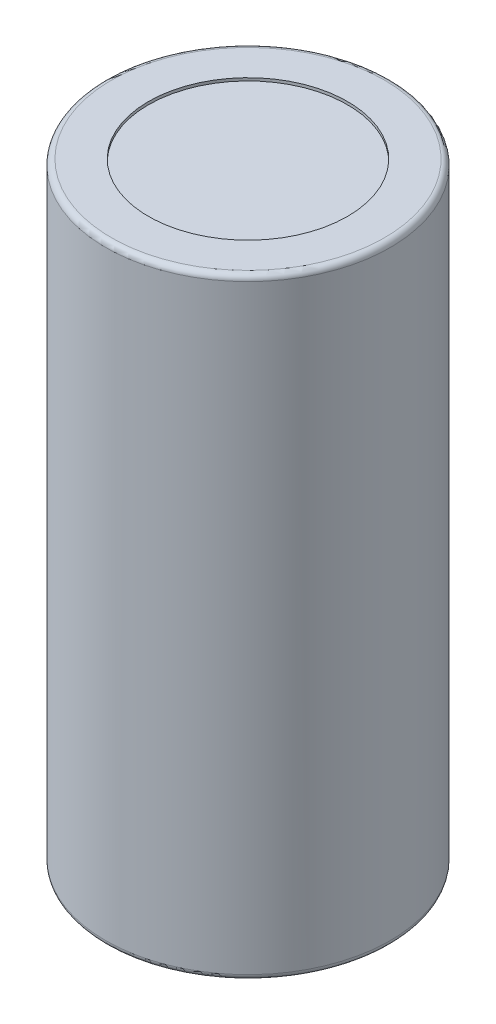
ISO-10303-21;
HEADER;
FILE_DESCRIPTION(('STEP AP214'),'2;1');
FILE_NAME('part.step','',(''),(''),'','','');
FILE_SCHEMA(('AUTOMOTIVE_DESIGN { 1 0 10303 214 1 1 1 1 }'));
ENDSEC;
DATA;
#1=APPLICATION_CONTEXT('core data for automotive mechanical design processes');
#2=APPLICATION_PROTOCOL_DEFINITION('international standard','automotive_design',2000,#1);
#3=PRODUCT_CONTEXT('',#1,'mechanical');
#4=PRODUCT('Part','Part','',(#3));
#5=PRODUCT_RELATED_PRODUCT_CATEGORY('part','',(#4));
#6=PRODUCT_DEFINITION_FORMATION('','',#4);
#7=PRODUCT_DEFINITION_CONTEXT('part definition',#1,'design');
#8=PRODUCT_DEFINITION('design','',#6,#7);
#9=PRODUCT_DEFINITION_SHAPE('','',#8);
#10=(LENGTH_UNIT() NAMED_UNIT(*) SI_UNIT(.MILLI.,.METRE.));
#11=(NAMED_UNIT(*) PLANE_ANGLE_UNIT() SI_UNIT($,.RADIAN.));
#12=(NAMED_UNIT(*) SI_UNIT($,.STERADIAN.) SOLID_ANGLE_UNIT());
#13=UNCERTAINTY_MEASURE_WITH_UNIT(LENGTH_MEASURE(1.E-05),#10,'distance_accuracy_value','');
#14=(GEOMETRIC_REPRESENTATION_CONTEXT(3) GLOBAL_UNCERTAINTY_ASSIGNED_CONTEXT((#13)) GLOBAL_UNIT_ASSIGNED_CONTEXT((#10,
#11,#12)) REPRESENTATION_CONTEXT('',''));
#15=CARTESIAN_POINT('',(0.,0.,0.));
#16=DIRECTION('',(0.,0.,1.));
#17=DIRECTION('',(1.,0.,0.));
#18=AXIS2_PLACEMENT_3D('',#15,#16,#17);
#19=CARTESIAN_POINT('',(75.0000011175871,21.4,6.00000008940696));
#20=DIRECTION('',(0.,-1.,0.));
#21=DIRECTION('',(-1.,0.,0.));
#22=AXIS2_PLACEMENT_3D('',#19,#20,#21);
#23=PLANE('',#22);
#24=CARTESIAN_POINT('',(75.0000011175871,21.4,6.00000008940696));
#25=DIRECTION('',(0.,-1.,0.));
#26=DIRECTION('',(1.,0.,0.));
#27=AXIS2_PLACEMENT_3D('',#24,#25,#26);
#28=CIRCLE('',#27,3.5);
#29=CARTESIAN_POINT('',(71.5000011175871,21.4,6.00000008940696));
#30=VERTEX_POINT('',#29);
#31=EDGE_CURVE('E11',#30,#30,#28,.T.);
#32=ORIENTED_EDGE('',*,*,#31,.F.);
#33=EDGE_LOOP('',(#32));
#34=FACE_BOUND('',#33,.T.);
#35=ADVANCED_FACE('F16',(#34),#23,.F.);
#36=CARTESIAN_POINT('',(75.0000011175871,21.45,6.00000008940696));
#37=DIRECTION('',(0.,-1.,0.));
#38=DIRECTION('',(1.,0.,0.));
#39=AXIS2_PLACEMENT_3D('',#36,#37,#38);
#40=CYLINDRICAL_SURFACE('',#39,3.5);
#41=CARTESIAN_POINT('',(75.0000011175871,21.5,6.00000008940696));
#42=DIRECTION('',(0.,-1.,0.));
#43=DIRECTION('',(1.,0.,0.));
#44=AXIS2_PLACEMENT_3D('',#41,#42,#43);
#45=CIRCLE('',#44,3.5);
#46=CARTESIAN_POINT('',(71.5000011175871,21.5,6.00000008940696));
#47=VERTEX_POINT('',#46);
#48=EDGE_CURVE('E87',#47,#47,#45,.T.);
#49=ORIENTED_EDGE('',*,*,#48,.F.);
#50=DIRECTION('',(0.,-1.,0.));
#51=VECTOR('',#50,1.);
#52=CARTESIAN_POINT('',(71.5000011175871,21.45,6.00000008940696));
#53=LINE('',#52,#51);
#54=EDGE_CURVE('E25',#47,#30,#53,.T.);
#55=ORIENTED_EDGE('',*,*,#54,.T.);
#56=ORIENTED_EDGE('',*,*,#31,.T.);
#57=ORIENTED_EDGE('',*,*,#54,.F.);
#58=EDGE_LOOP('',(#49,#55,#56,#57));
#59=FACE_BOUND('',#58,.T.);
#60=ADVANCED_FACE('F135',(#59),#40,.F.);
#61=CARTESIAN_POINT('',(75.0000011175871,21.5,6.00000008940696));
#62=DIRECTION('',(0.,1.,0.));
#63=DIRECTION('',(0.,0.,-1.));
#64=AXIS2_PLACEMENT_3D('',#61,#62,#63);
#65=PLANE('',#64);
#66=ORIENTED_EDGE('',*,*,#48,.T.);
#67=EDGE_LOOP('',(#66));
#68=FACE_BOUND('',#67,.T.);
#69=CARTESIAN_POINT('',(75.0000011175871,21.5,6.00000008940696));
#70=DIRECTION('',(0.,-1.,0.));
#71=DIRECTION('',(-1.,0.,0.));
#72=AXIS2_PLACEMENT_3D('',#69,#70,#71);
#73=CIRCLE('',#72,4.80000007450581);
#74=CARTESIAN_POINT('',(75.0000011175871,21.5,1.20000001490116));
#75=VERTEX_POINT('',#74);
#76=EDGE_CURVE('E19',#75,#75,#73,.T.);
#77=ORIENTED_EDGE('',*,*,#76,.F.);
#78=EDGE_LOOP('',(#77));
#79=FACE_BOUND('',#78,.T.);
#80=ADVANCED_FACE('F131',(#68,#79),#65,.T.);
#81=CARTESIAN_POINT('',(75.0000011175871,21.3,6.00000008940696));
#82=DIRECTION('',(0.,1.,0.));
#83=DIRECTION('',(0.,0.,1.));
#84=AXIS2_PLACEMENT_3D('',#81,#82,#83);
#85=TOROIDAL_SURFACE('',#84,4.80000007450581,0.2);
#86=ORIENTED_EDGE('',*,*,#76,.T.);
#87=CARTESIAN_POINT('',(75.0000011175871,21.3,1.20000001490116));
#88=DIRECTION('',(-1.,0.,0.));
#89=DIRECTION('',(0.,0.,-1.));
#90=AXIS2_PLACEMENT_3D('',#87,#88,#89);
#91=CIRCLE('',#90,0.2);
#92=CARTESIAN_POINT('',(75.0000011175871,21.3,1.00000001490116));
#93=VERTEX_POINT('',#92);
#94=EDGE_CURVE('E83',#75,#93,#91,.T.);
#95=ORIENTED_EDGE('',*,*,#94,.T.);
#96=CARTESIAN_POINT('',(75.0000011175871,21.3,6.00000008940696));
#97=DIRECTION('',(0.,1.,0.));
#98=DIRECTION('',(-1.,0.,0.));
#99=AXIS2_PLACEMENT_3D('',#96,#97,#98);
#100=CIRCLE('',#99,5.00000007450581);
#101=CARTESIAN_POINT('',(70.0000010430813,21.3,6.00000008940696));
#102=VERTEX_POINT('',#101);
#103=EDGE_CURVE('E79',#93,#102,#100,.T.);
#104=ORIENTED_EDGE('',*,*,#103,.T.);
#105=CARTESIAN_POINT('',(75.0000011175871,21.3,6.00000008940696));
#106=DIRECTION('',(0.,1.,0.));
#107=DIRECTION('',(-1.,0.,0.));
#108=AXIS2_PLACEMENT_3D('',#105,#106,#107);
#109=CIRCLE('',#108,5.00000007450581);
#110=EDGE_CURVE('E92',#102,#93,#109,.T.);
#111=ORIENTED_EDGE('',*,*,#110,.T.);
#112=ORIENTED_EDGE('',*,*,#94,.F.);
#113=EDGE_LOOP('',(#86,#95,#104,#111,#112));
#114=FACE_BOUND('',#113,.T.);
#115=ADVANCED_FACE('F84',(#114),#85,.T.);
#116=CARTESIAN_POINT('',(75.0000011175871,0.,6.00000008940697));
#117=DIRECTION('',(0.,-1.,0.));
#118=DIRECTION('',(-1.,0.,0.));
#119=AXIS2_PLACEMENT_3D('',#116,#117,#118);
#120=PLANE('',#119);
#121=CARTESIAN_POINT('',(75.0000011175871,0.,6.00000008940697));
#122=DIRECTION('',(0.,1.,0.));
#123=DIRECTION('',(-1.,0.,0.));
#124=AXIS2_PLACEMENT_3D('',#121,#122,#123);
#125=CIRCLE('',#124,4.80000007450581);
#126=CARTESIAN_POINT('',(75.0000011175871,0.,10.8000001639128));
#127=VERTEX_POINT('',#126);
#128=EDGE_CURVE('E112',#127,#127,#125,.T.);
#129=ORIENTED_EDGE('',*,*,#128,.F.);
#130=EDGE_LOOP('',(#129));
#131=FACE_BOUND('',#130,.T.);
#132=ADVANCED_FACE('F122',(#131),#120,.T.);
#133=CARTESIAN_POINT('',(75.0000011175871,10.75,6.00000008940697));
#134=DIRECTION('',(0.,1.,0.));
#135=DIRECTION('',(1.,0.,0.));
#136=AXIS2_PLACEMENT_3D('',#133,#134,#135);
#137=CYLINDRICAL_SURFACE('',#136,5.00000007450581);
#138=ORIENTED_EDGE('',*,*,#110,.F.);
#139=DIRECTION('',(0.,-1.,0.));
#140=VECTOR('',#139,1.);
#141=CARTESIAN_POINT('',(70.0000010430813,10.75,6.00000008940697));
#142=LINE('',#141,#140);
#143=CARTESIAN_POINT('',(70.0000010430813,0.2,6.00000008940697));
#144=VERTEX_POINT('',#143);
#145=EDGE_CURVE('E93',#102,#144,#142,.T.);
#146=ORIENTED_EDGE('',*,*,#145,.T.);
#147=CARTESIAN_POINT('',(75.0000011175871,0.2,6.00000008940697));
#148=DIRECTION('',(0.,-1.,0.));
#149=DIRECTION('',(-1.,0.,0.));
#150=AXIS2_PLACEMENT_3D('',#147,#148,#149);
#151=CIRCLE('',#150,5.00000007450581);
#152=CARTESIAN_POINT('',(75.0000011175871,0.2,11.0000001639128));
#153=VERTEX_POINT('',#152);
#154=EDGE_CURVE('E103',#153,#144,#151,.T.);
#155=ORIENTED_EDGE('',*,*,#154,.F.);
#156=CARTESIAN_POINT('',(75.0000011175871,0.2,6.00000008940697));
#157=DIRECTION('',(0.,-1.,0.));
#158=DIRECTION('',(-1.,0.,0.));
#159=AXIS2_PLACEMENT_3D('',#156,#157,#158);
#160=CIRCLE('',#159,5.00000007450581);
#161=EDGE_CURVE('E59',#144,#153,#160,.T.);
#162=ORIENTED_EDGE('',*,*,#161,.F.);
#163=ORIENTED_EDGE('',*,*,#145,.F.);
#164=ORIENTED_EDGE('',*,*,#103,.F.);
#165=EDGE_LOOP('',(#138,#146,#155,#162,#163,#164));
#166=FACE_BOUND('',#165,.T.);
#167=ADVANCED_FACE('F91',(#166),#137,.T.);
#168=CARTESIAN_POINT('',(75.0000011175871,0.2,6.00000008940697));
#169=DIRECTION('',(0.,-1.,0.));
#170=DIRECTION('',(0.,0.,-1.));
#171=AXIS2_PLACEMENT_3D('',#168,#169,#170);
#172=TOROIDAL_SURFACE('',#171,4.80000007450581,0.2);
#173=ORIENTED_EDGE('',*,*,#128,.T.);
#174=CARTESIAN_POINT('',(75.0000011175871,0.2,10.8000001639128));
#175=DIRECTION('',(-1.,0.,0.));
#176=DIRECTION('',(0.,0.,1.));
#177=AXIS2_PLACEMENT_3D('',#174,#175,#176);
#178=CIRCLE('',#177,0.2);
#179=EDGE_CURVE('E71',#127,#153,#178,.T.);
#180=ORIENTED_EDGE('',*,*,#179,.T.);
#181=ORIENTED_EDGE('',*,*,#154,.T.);
#182=ORIENTED_EDGE('',*,*,#161,.T.);
#183=ORIENTED_EDGE('',*,*,#179,.F.);
#184=EDGE_LOOP('',(#173,#180,#181,#182,#183));
#185=FACE_BOUND('',#184,.T.);
#186=ADVANCED_FACE('F120',(#185),#172,.T.);
#187=CLOSED_SHELL('',(#35,#60,#80,#115,#132,#167,#186));
#188=MANIFOLD_SOLID_BREP('B1',#187);
#189=ADVANCED_BREP_SHAPE_REPRESENTATION('',(#18,#188),#14);
#190=SHAPE_DEFINITION_REPRESENTATION(#9,#189);
ENDSEC;
END-ISO-10303-21;
